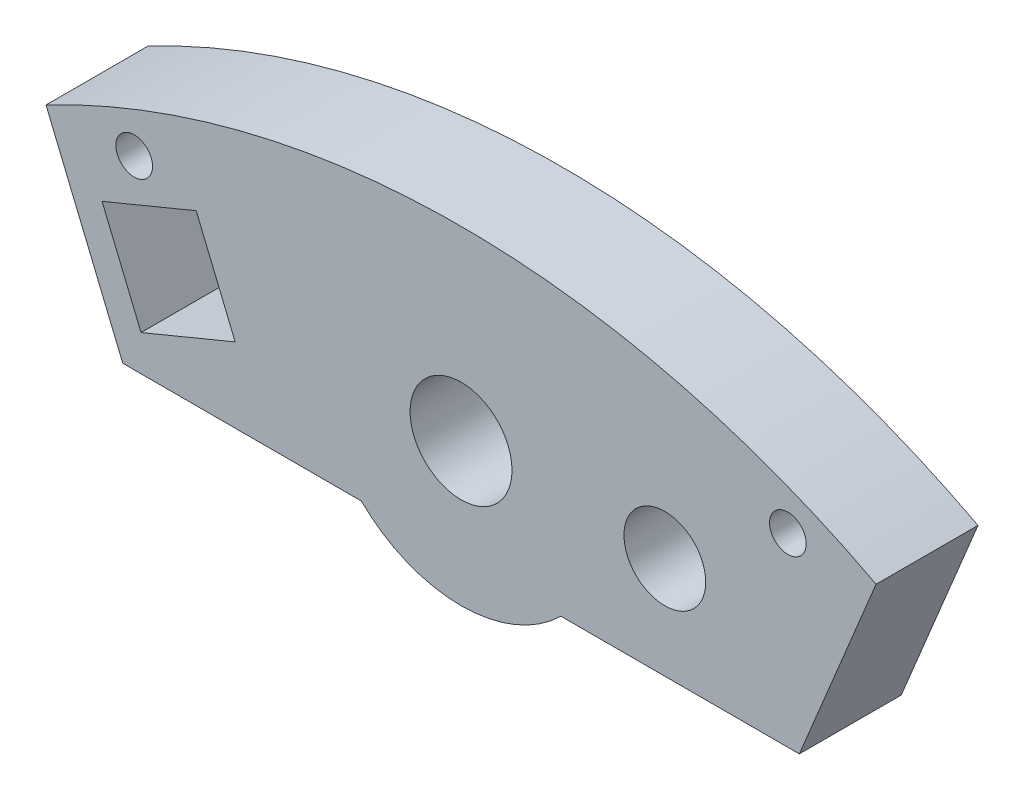
ISO-10303-21;
HEADER;
FILE_DESCRIPTION(('STEP AP214'),'2;1');
FILE_NAME('part.step','',(''),(''),'','','');
FILE_SCHEMA(('AUTOMOTIVE_DESIGN { 1 0 10303 214 1 1 1 1 }'));
ENDSEC;
DATA;
#1=APPLICATION_CONTEXT('core data for automotive mechanical design processes');
#2=APPLICATION_PROTOCOL_DEFINITION('international standard','automotive_design',2000,#1);
#3=PRODUCT_CONTEXT('',#1,'mechanical');
#4=PRODUCT('Part','Part','',(#3));
#5=PRODUCT_RELATED_PRODUCT_CATEGORY('part','',(#4));
#6=PRODUCT_DEFINITION_FORMATION('','',#4);
#7=PRODUCT_DEFINITION_CONTEXT('part definition',#1,'design');
#8=PRODUCT_DEFINITION('design','',#6,#7);
#9=PRODUCT_DEFINITION_SHAPE('','',#8);
#10=(LENGTH_UNIT() NAMED_UNIT(*) SI_UNIT(.MILLI.,.METRE.));
#11=(NAMED_UNIT(*) PLANE_ANGLE_UNIT() SI_UNIT($,.RADIAN.));
#12=(NAMED_UNIT(*) SI_UNIT($,.STERADIAN.) SOLID_ANGLE_UNIT());
#13=UNCERTAINTY_MEASURE_WITH_UNIT(LENGTH_MEASURE(1.E-05),#10,'distance_accuracy_value','');
#14=(GEOMETRIC_REPRESENTATION_CONTEXT(3) GLOBAL_UNCERTAINTY_ASSIGNED_CONTEXT((#13)) GLOBAL_UNIT_ASSIGNED_CONTEXT((#10,
#11,#12)) REPRESENTATION_CONTEXT('',''));
#15=CARTESIAN_POINT('',(0.,0.,0.));
#16=DIRECTION('',(0.,0.,1.));
#17=DIRECTION('',(1.,0.,0.));
#18=AXIS2_PLACEMENT_3D('',#15,#16,#17);
#19=CARTESIAN_POINT('',(0.,0.,10.));
#20=DIRECTION('',(0.,0.,1.));
#21=DIRECTION('',(1.,0.,0.));
#22=AXIS2_PLACEMENT_3D('',#19,#20,#21);
#23=PLANE('',#22);
#24=CARTESIAN_POINT('',(-32.0764524899467,8.18940663404685,10.));
#25=DIRECTION('',(0.,0.,1.));
#26=DIRECTION('',(1.,0.,0.));
#27=AXIS2_PLACEMENT_3D('',#24,#25,#26);
#28=CIRCLE('',#27,1.8);
#29=CARTESIAN_POINT('',(-30.2764524899467,8.18940663404685,10.));
#30=VERTEX_POINT('',#29);
#31=EDGE_CURVE('E152',#30,#30,#28,.T.);
#32=ORIENTED_EDGE('',*,*,#31,.F.);
#33=EDGE_LOOP('',(#32));
#34=FACE_BOUND('',#33,.T.);
#35=CARTESIAN_POINT('',(20.,0.,10.));
#36=DIRECTION('',(0.,0.,1.));
#37=DIRECTION('',(1.,0.,0.));
#38=AXIS2_PLACEMENT_3D('',#35,#36,#37);
#39=CIRCLE('',#38,4.0125);
#40=CARTESIAN_POINT('',(24.0125,0.,10.));
#41=VERTEX_POINT('',#40);
#42=EDGE_CURVE('E176',#41,#41,#39,.T.);
#43=ORIENTED_EDGE('',*,*,#42,.F.);
#44=EDGE_LOOP('',(#43));
#45=FACE_BOUND('',#44,.T.);
#46=DIRECTION('',(0.382683432365087,0.923879532511288,0.));
#47=VECTOR('',#46,1.);
#48=CARTESIAN_POINT('',(40.7355900922859,8.18940663404685,10.));
#49=LINE('',#48,#47);
#50=CARTESIAN_POINT('',(33.2012911729446,-10.,10.));
#51=VERTEX_POINT('',#50);
#52=CARTESIAN_POINT('',(40.7355900922859,8.18940663404685,10.));
#53=VERTEX_POINT('',#52);
#54=EDGE_CURVE('E184',#51,#53,#49,.T.);
#55=ORIENTED_EDGE('',*,*,#54,.T.);
#56=CARTESIAN_POINT('',(0.,-69.25,10.));
#57=DIRECTION('',(0.,0.,1.));
#58=DIRECTION('',(1.,0.,0.));
#59=AXIS2_PLACEMENT_3D('',#56,#57,#58);
#60=CIRCLE('',#59,87.5);
#61=CARTESIAN_POINT('',(-40.7355900922859,8.18940663404685,10.));
#62=VERTEX_POINT('',#61);
#63=EDGE_CURVE('E188',#53,#62,#60,.T.);
#64=ORIENTED_EDGE('',*,*,#63,.T.);
#65=DIRECTION('',(0.382683432365087,-0.923879532511288,0.));
#66=VECTOR('',#65,1.);
#67=CARTESIAN_POINT('',(-40.7355900922859,8.18940663404685,10.));
#68=LINE('',#67,#66);
#69=CARTESIAN_POINT('',(-33.2012911729446,-10.,10.));
#70=VERTEX_POINT('',#69);
#71=EDGE_CURVE('E192',#62,#70,#68,.T.);
#72=ORIENTED_EDGE('',*,*,#71,.T.);
#73=DIRECTION('',(1.,0.,0.));
#74=VECTOR('',#73,1.);
#75=CARTESIAN_POINT('',(-33.2012911729446,-10.,10.));
#76=LINE('',#75,#74);
#77=CARTESIAN_POINT('',(-9.79795897113272,-9.99999999999999,10.));
#78=VERTEX_POINT('',#77);
#79=EDGE_CURVE('E195',#70,#78,#76,.T.);
#80=ORIENTED_EDGE('',*,*,#79,.T.);
#81=CARTESIAN_POINT('',(0.,0.,10.));
#82=DIRECTION('',(0.,0.,1.));
#83=DIRECTION('',(1.,0.,0.));
#84=AXIS2_PLACEMENT_3D('',#81,#82,#83);
#85=CIRCLE('',#84,14.);
#86=CARTESIAN_POINT('',(9.79795897113271,-10.,10.));
#87=VERTEX_POINT('',#86);
#88=EDGE_CURVE('E198',#78,#87,#85,.T.);
#89=ORIENTED_EDGE('',*,*,#88,.T.);
#90=DIRECTION('',(1.,0.,0.));
#91=VECTOR('',#90,1.);
#92=CARTESIAN_POINT('',(33.2012911729446,-10.,10.));
#93=LINE('',#92,#91);
#94=EDGE_CURVE('E201',#87,#51,#93,.T.);
#95=ORIENTED_EDGE('',*,*,#94,.T.);
#96=EDGE_LOOP('',(#55,#64,#72,#80,#89,#95));
#97=FACE_BOUND('',#96,.T.);
#98=CARTESIAN_POINT('',(0.,0.,10.));
#99=DIRECTION('',(0.,0.,1.));
#100=DIRECTION('',(1.,0.,0.));
#101=AXIS2_PLACEMENT_3D('',#98,#99,#100);
#102=CIRCLE('',#101,5.);
#103=CARTESIAN_POINT('',(5.,0.,10.));
#104=VERTEX_POINT('',#103);
#105=EDGE_CURVE('E168',#104,#104,#102,.T.);
#106=ORIENTED_EDGE('',*,*,#105,.F.);
#107=EDGE_LOOP('',(#106));
#108=FACE_BOUND('',#107,.T.);
#109=DIRECTION('',(-0.923879532511288,-0.382683432365087,0.));
#110=VECTOR('',#109,1.);
#111=CARTESIAN_POINT('',(-25.9952769266503,6.57377976272854,10.));
#112=LINE('',#111,#110);
#113=CARTESIAN_POINT('',(-25.9952769266503,6.57377976272854,10.));
#114=VERTEX_POINT('',#113);
#115=CARTESIAN_POINT('',(-35.2340722517632,2.74694543907767,10.));
#116=VERTEX_POINT('',#115);
#117=EDGE_CURVE('E126',#114,#116,#112,.T.);
#118=ORIENTED_EDGE('',*,*,#117,.F.);
#119=DIRECTION('',(-0.382683432365087,0.923879532511288,0.));
#120=VECTOR('',#119,1.);
#121=CARTESIAN_POINT('',(-22.1684426029994,-2.66501556238433,10.));
#122=LINE('',#121,#120);
#123=CARTESIAN_POINT('',(-22.1684426029994,-2.66501556238433,10.));
#124=VERTEX_POINT('',#123);
#125=EDGE_CURVE('E117',#124,#114,#122,.T.);
#126=ORIENTED_EDGE('',*,*,#125,.F.);
#127=DIRECTION('',(0.923879532511288,0.382683432365087,0.));
#128=VECTOR('',#127,1.);
#129=CARTESIAN_POINT('',(-31.4072379281123,-6.4918498860352,10.));
#130=LINE('',#129,#128);
#131=CARTESIAN_POINT('',(-31.4072379281123,-6.4918498860352,10.));
#132=VERTEX_POINT('',#131);
#133=EDGE_CURVE('E144',#132,#124,#130,.T.);
#134=ORIENTED_EDGE('',*,*,#133,.F.);
#135=DIRECTION('',(0.382683432365087,-0.923879532511288,0.));
#136=VECTOR('',#135,1.);
#137=CARTESIAN_POINT('',(-35.2340722517632,2.74694543907767,10.));
#138=LINE('',#137,#136);
#139=EDGE_CURVE('E140',#116,#132,#138,.T.);
#140=ORIENTED_EDGE('',*,*,#139,.F.);
#141=EDGE_LOOP('',(#118,#126,#134,#140));
#142=FACE_BOUND('',#141,.T.);
#143=CARTESIAN_POINT('',(32.0764524899467,8.18940663404685,10.));
#144=DIRECTION('',(0.,0.,1.));
#145=DIRECTION('',(-1.,0.,0.));
#146=AXIS2_PLACEMENT_3D('',#143,#144,#145);
#147=CIRCLE('',#146,1.8);
#148=CARTESIAN_POINT('',(30.2764524899467,8.18940663404685,10.));
#149=VERTEX_POINT('',#148);
#150=EDGE_CURVE('E318',#149,#149,#147,.T.);
#151=ORIENTED_EDGE('',*,*,#150,.F.);
#152=EDGE_LOOP('',(#151));
#153=FACE_BOUND('',#152,.T.);
#154=ADVANCED_FACE('F39',(#34,#45,#97,#108,#142,#153),#23,.T.);
#155=CARTESIAN_POINT('',(0.,0.,0.));
#156=DIRECTION('',(0.,0.,1.));
#157=DIRECTION('',(1.,0.,0.));
#158=AXIS2_PLACEMENT_3D('',#155,#156,#157);
#159=PLANE('',#158);
#160=CARTESIAN_POINT('',(0.,0.,0.));
#161=DIRECTION('',(0.,0.,1.));
#162=DIRECTION('',(1.,0.,0.));
#163=AXIS2_PLACEMENT_3D('',#160,#161,#162);
#164=CIRCLE('',#163,5.);
#165=CARTESIAN_POINT('',(5.,0.,0.));
#166=VERTEX_POINT('',#165);
#167=EDGE_CURVE('E135',#166,#166,#164,.T.);
#168=ORIENTED_EDGE('',*,*,#167,.T.);
#169=EDGE_LOOP('',(#168));
#170=FACE_BOUND('',#169,.T.);
#171=CARTESIAN_POINT('',(20.,0.,0.));
#172=DIRECTION('',(0.,0.,1.));
#173=DIRECTION('',(1.,0.,0.));
#174=AXIS2_PLACEMENT_3D('',#171,#172,#173);
#175=CIRCLE('',#174,4.0125);
#176=CARTESIAN_POINT('',(24.0125,0.,0.));
#177=VERTEX_POINT('',#176);
#178=EDGE_CURVE('E172',#177,#177,#175,.T.);
#179=ORIENTED_EDGE('',*,*,#178,.T.);
#180=EDGE_LOOP('',(#179));
#181=FACE_BOUND('',#180,.T.);
#182=DIRECTION('',(0.382683432365087,0.923879532511288,0.));
#183=VECTOR('',#182,1.);
#184=CARTESIAN_POINT('',(40.7355900922859,8.18940663404685,0.));
#185=LINE('',#184,#183);
#186=CARTESIAN_POINT('',(33.2012911729446,-10.,0.));
#187=VERTEX_POINT('',#186);
#188=CARTESIAN_POINT('',(40.7355900922859,8.18940663404685,0.));
#189=VERTEX_POINT('',#188);
#190=EDGE_CURVE('E180',#187,#189,#185,.T.);
#191=ORIENTED_EDGE('',*,*,#190,.F.);
#192=DIRECTION('',(1.,0.,0.));
#193=VECTOR('',#192,1.);
#194=CARTESIAN_POINT('',(33.2012911729446,-10.,0.));
#195=LINE('',#194,#193);
#196=CARTESIAN_POINT('',(9.79795897113271,-10.,0.));
#197=VERTEX_POINT('',#196);
#198=EDGE_CURVE('E189',#197,#187,#195,.T.);
#199=ORIENTED_EDGE('',*,*,#198,.F.);
#200=CARTESIAN_POINT('',(0.,0.,0.));
#201=DIRECTION('',(0.,0.,1.));
#202=DIRECTION('',(1.,0.,0.));
#203=AXIS2_PLACEMENT_3D('',#200,#201,#202);
#204=CIRCLE('',#203,14.);
#205=CARTESIAN_POINT('',(-9.79795897113272,-9.99999999999999,0.));
#206=VERTEX_POINT('',#205);
#207=EDGE_CURVE('E217',#206,#197,#204,.T.);
#208=ORIENTED_EDGE('',*,*,#207,.F.);
#209=DIRECTION('',(1.,0.,0.));
#210=VECTOR('',#209,1.);
#211=CARTESIAN_POINT('',(-33.2012911729446,-10.,0.));
#212=LINE('',#211,#210);
#213=CARTESIAN_POINT('',(-33.2012911729446,-10.,0.));
#214=VERTEX_POINT('',#213);
#215=EDGE_CURVE('E214',#214,#206,#212,.T.);
#216=ORIENTED_EDGE('',*,*,#215,.F.);
#217=DIRECTION('',(0.382683432365087,-0.923879532511288,0.));
#218=VECTOR('',#217,1.);
#219=CARTESIAN_POINT('',(-40.7355900922859,8.18940663404685,0.));
#220=LINE('',#219,#218);
#221=CARTESIAN_POINT('',(-40.7355900922859,8.18940663404685,0.));
#222=VERTEX_POINT('',#221);
#223=EDGE_CURVE('E211',#222,#214,#220,.T.);
#224=ORIENTED_EDGE('',*,*,#223,.F.);
#225=CARTESIAN_POINT('',(0.,-69.25,0.));
#226=DIRECTION('',(0.,0.,1.));
#227=DIRECTION('',(1.,0.,0.));
#228=AXIS2_PLACEMENT_3D('',#225,#226,#227);
#229=CIRCLE('',#228,87.5);
#230=EDGE_CURVE('E208',#189,#222,#229,.T.);
#231=ORIENTED_EDGE('',*,*,#230,.F.);
#232=EDGE_LOOP('',(#191,#199,#208,#216,#224,#231));
#233=FACE_BOUND('',#232,.T.);
#234=DIRECTION('',(-0.382683432365087,0.923879532511288,0.));
#235=VECTOR('',#234,1.);
#236=CARTESIAN_POINT('',(-22.1684426029994,-2.66501556238433,0.));
#237=LINE('',#236,#235);
#238=CARTESIAN_POINT('',(-22.1684426029994,-2.66501556238433,0.));
#239=VERTEX_POINT('',#238);
#240=CARTESIAN_POINT('',(-25.9952769266503,6.57377976272854,0.));
#241=VERTEX_POINT('',#240);
#242=EDGE_CURVE('E63',#239,#241,#237,.T.);
#243=ORIENTED_EDGE('',*,*,#242,.T.);
#244=DIRECTION('',(-0.923879532511288,-0.382683432365087,0.));
#245=VECTOR('',#244,1.);
#246=CARTESIAN_POINT('',(-25.9952769266503,6.57377976272854,0.));
#247=LINE('',#246,#245);
#248=CARTESIAN_POINT('',(-35.2340722517632,2.74694543907767,0.));
#249=VERTEX_POINT('',#248);
#250=EDGE_CURVE('E133',#241,#249,#247,.T.);
#251=ORIENTED_EDGE('',*,*,#250,.T.);
#252=DIRECTION('',(0.382683432365087,-0.923879532511288,0.));
#253=VECTOR('',#252,1.);
#254=CARTESIAN_POINT('',(-35.2340722517632,2.74694543907767,0.));
#255=LINE('',#254,#253);
#256=CARTESIAN_POINT('',(-31.4072379281123,-6.4918498860352,0.));
#257=VERTEX_POINT('',#256);
#258=EDGE_CURVE('E155',#249,#257,#255,.T.);
#259=ORIENTED_EDGE('',*,*,#258,.T.);
#260=DIRECTION('',(0.923879532511288,0.382683432365087,0.));
#261=VECTOR('',#260,1.);
#262=CARTESIAN_POINT('',(-31.4072379281123,-6.4918498860352,0.));
#263=LINE('',#262,#261);
#264=EDGE_CURVE('E127',#257,#239,#263,.T.);
#265=ORIENTED_EDGE('',*,*,#264,.T.);
#266=EDGE_LOOP('',(#243,#251,#259,#265));
#267=FACE_BOUND('',#266,.T.);
#268=CARTESIAN_POINT('',(-32.0764524899467,8.18940663404685,0.));
#269=DIRECTION('',(0.,0.,1.));
#270=DIRECTION('',(1.,0.,0.));
#271=AXIS2_PLACEMENT_3D('',#268,#269,#270);
#272=CIRCLE('',#271,1.8);
#273=CARTESIAN_POINT('',(-30.2764524899467,8.18940663404685,0.));
#274=VERTEX_POINT('',#273);
#275=EDGE_CURVE('E326',#274,#274,#272,.T.);
#276=ORIENTED_EDGE('',*,*,#275,.T.);
#277=EDGE_LOOP('',(#276));
#278=FACE_BOUND('',#277,.T.);
#279=CARTESIAN_POINT('',(32.0764524899467,8.18940663404685,0.));
#280=DIRECTION('',(0.,0.,1.));
#281=DIRECTION('',(-1.,0.,0.));
#282=AXIS2_PLACEMENT_3D('',#279,#280,#281);
#283=CIRCLE('',#282,1.8);
#284=CARTESIAN_POINT('',(30.2764524899467,8.18940663404685,0.));
#285=VERTEX_POINT('',#284);
#286=EDGE_CURVE('E321',#285,#285,#283,.T.);
#287=ORIENTED_EDGE('',*,*,#286,.T.);
#288=EDGE_LOOP('',(#287));
#289=FACE_BOUND('',#288,.T.);
#290=ADVANCED_FACE('F248',(#170,#181,#233,#267,#278,#289),#159,.F.);
#291=CARTESIAN_POINT('',(40.7355900922859,8.18940663404685,10.));
#292=DIRECTION('',(-0.923879532511288,0.382683432365087,0.));
#293=DIRECTION('',(-0.382683432365087,-0.923879532511288,0.));
#294=AXIS2_PLACEMENT_3D('',#291,#292,#293);
#295=PLANE('',#294);
#296=ORIENTED_EDGE('',*,*,#190,.T.);
#297=DIRECTION('',(0.,0.,-1.));
#298=VECTOR('',#297,1.);
#299=CARTESIAN_POINT('',(40.7355900922859,8.18940663404685,10.));
#300=LINE('',#299,#298);
#301=EDGE_CURVE('E11',#53,#189,#300,.T.);
#302=ORIENTED_EDGE('',*,*,#301,.F.);
#303=ORIENTED_EDGE('',*,*,#54,.F.);
#304=DIRECTION('',(0.,0.,-1.));
#305=VECTOR('',#304,1.);
#306=CARTESIAN_POINT('',(33.2012911729446,-10.,10.));
#307=LINE('',#306,#305);
#308=EDGE_CURVE('E204',#51,#187,#307,.T.);
#309=ORIENTED_EDGE('',*,*,#308,.T.);
#310=EDGE_LOOP('',(#296,#302,#303,#309));
#311=FACE_BOUND('',#310,.T.);
#312=ADVANCED_FACE('F41',(#311),#295,.F.);
#313=CARTESIAN_POINT('',(0.,-69.25,10.));
#314=DIRECTION('',(0.,0.,-1.));
#315=DIRECTION('',(-1.,0.,0.));
#316=AXIS2_PLACEMENT_3D('',#313,#314,#315);
#317=CYLINDRICAL_SURFACE('',#316,87.5);
#318=ORIENTED_EDGE('',*,*,#230,.T.);
#319=DIRECTION('',(0.,0.,-1.));
#320=VECTOR('',#319,1.);
#321=CARTESIAN_POINT('',(-40.7355900922859,8.18940663404685,10.));
#322=LINE('',#321,#320);
#323=EDGE_CURVE('E48',#62,#222,#322,.T.);
#324=ORIENTED_EDGE('',*,*,#323,.F.);
#325=ORIENTED_EDGE('',*,*,#63,.F.);
#326=ORIENTED_EDGE('',*,*,#301,.T.);
#327=EDGE_LOOP('',(#318,#324,#325,#326));
#328=FACE_BOUND('',#327,.T.);
#329=ADVANCED_FACE('F266',(#328),#317,.T.);
#330=CARTESIAN_POINT('',(-40.7355900922859,8.18940663404685,10.));
#331=DIRECTION('',(0.923879532511288,0.382683432365087,0.));
#332=DIRECTION('',(-0.382683432365087,0.923879532511288,0.));
#333=AXIS2_PLACEMENT_3D('',#330,#331,#332);
#334=PLANE('',#333);
#335=ORIENTED_EDGE('',*,*,#223,.T.);
#336=DIRECTION('',(0.,0.,-1.));
#337=VECTOR('',#336,1.);
#338=CARTESIAN_POINT('',(-33.2012911729446,-10.,10.));
#339=LINE('',#338,#337);
#340=EDGE_CURVE('E233',#70,#214,#339,.T.);
#341=ORIENTED_EDGE('',*,*,#340,.F.);
#342=ORIENTED_EDGE('',*,*,#71,.F.);
#343=ORIENTED_EDGE('',*,*,#323,.T.);
#344=EDGE_LOOP('',(#335,#341,#342,#343));
#345=FACE_BOUND('',#344,.T.);
#346=ADVANCED_FACE('F242',(#345),#334,.F.);
#347=CARTESIAN_POINT('',(-33.2012911729446,-10.,10.));
#348=DIRECTION('',(0.,1.,0.));
#349=DIRECTION('',(0.,0.,1.));
#350=AXIS2_PLACEMENT_3D('',#347,#348,#349);
#351=PLANE('',#350);
#352=ORIENTED_EDGE('',*,*,#215,.T.);
#353=DIRECTION('',(0.,0.,-1.));
#354=VECTOR('',#353,1.);
#355=CARTESIAN_POINT('',(-9.79795897113272,-9.99999999999999,10.));
#356=LINE('',#355,#354);
#357=EDGE_CURVE('E229',#78,#206,#356,.T.);
#358=ORIENTED_EDGE('',*,*,#357,.F.);
#359=ORIENTED_EDGE('',*,*,#79,.F.);
#360=ORIENTED_EDGE('',*,*,#340,.T.);
#361=EDGE_LOOP('',(#352,#358,#359,#360));
#362=FACE_BOUND('',#361,.T.);
#363=ADVANCED_FACE('F254',(#362),#351,.F.);
#364=CARTESIAN_POINT('',(0.,0.,10.));
#365=DIRECTION('',(0.,0.,-1.));
#366=DIRECTION('',(-1.,0.,0.));
#367=AXIS2_PLACEMENT_3D('',#364,#365,#366);
#368=CYLINDRICAL_SURFACE('',#367,14.);
#369=ORIENTED_EDGE('',*,*,#207,.T.);
#370=DIRECTION('',(0.,0.,-1.));
#371=VECTOR('',#370,1.);
#372=CARTESIAN_POINT('',(9.79795897113271,-10.,10.));
#373=LINE('',#372,#371);
#374=EDGE_CURVE('E225',#87,#197,#373,.T.);
#375=ORIENTED_EDGE('',*,*,#374,.F.);
#376=ORIENTED_EDGE('',*,*,#88,.F.);
#377=ORIENTED_EDGE('',*,*,#357,.T.);
#378=EDGE_LOOP('',(#369,#375,#376,#377));
#379=FACE_BOUND('',#378,.T.);
#380=ADVANCED_FACE('F258',(#379),#368,.T.);
#381=CARTESIAN_POINT('',(33.2012911729446,-10.,10.));
#382=DIRECTION('',(0.,1.,0.));
#383=DIRECTION('',(0.,0.,1.));
#384=AXIS2_PLACEMENT_3D('',#381,#382,#383);
#385=PLANE('',#384);
#386=ORIENTED_EDGE('',*,*,#198,.T.);
#387=ORIENTED_EDGE('',*,*,#308,.F.);
#388=ORIENTED_EDGE('',*,*,#94,.F.);
#389=ORIENTED_EDGE('',*,*,#374,.T.);
#390=EDGE_LOOP('',(#386,#387,#388,#389));
#391=FACE_BOUND('',#390,.T.);
#392=ADVANCED_FACE('F269',(#391),#385,.F.);
#393=CARTESIAN_POINT('',(20.,0.,10.));
#394=DIRECTION('',(0.,0.,-1.));
#395=DIRECTION('',(-1.,0.,0.));
#396=AXIS2_PLACEMENT_3D('',#393,#394,#395);
#397=CYLINDRICAL_SURFACE('',#396,4.0125);
#398=ORIENTED_EDGE('',*,*,#42,.T.);
#399=EDGE_LOOP('',(#398));
#400=FACE_BOUND('',#399,.T.);
#401=ORIENTED_EDGE('',*,*,#178,.F.);
#402=EDGE_LOOP('',(#401));
#403=FACE_BOUND('',#402,.T.);
#404=ADVANCED_FACE('F271',(#400,#403),#397,.F.);
#405=CARTESIAN_POINT('',(0.,0.,10.));
#406=DIRECTION('',(0.,0.,-1.));
#407=DIRECTION('',(-1.,0.,0.));
#408=AXIS2_PLACEMENT_3D('',#405,#406,#407);
#409=CYLINDRICAL_SURFACE('',#408,5.);
#410=ORIENTED_EDGE('',*,*,#105,.T.);
#411=EDGE_LOOP('',(#410));
#412=FACE_BOUND('',#411,.T.);
#413=ORIENTED_EDGE('',*,*,#167,.F.);
#414=EDGE_LOOP('',(#413));
#415=FACE_BOUND('',#414,.T.);
#416=ADVANCED_FACE('F277',(#412,#415),#409,.F.);
#417=CARTESIAN_POINT('',(-22.1684426029994,-2.66501556238433,10.));
#418=DIRECTION('',(-0.923879532511288,-0.382683432365087,0.));
#419=DIRECTION('',(0.382683432365087,-0.923879532511288,0.));
#420=AXIS2_PLACEMENT_3D('',#417,#418,#419);
#421=PLANE('',#420);
#422=ORIENTED_EDGE('',*,*,#242,.F.);
#423=DIRECTION('',(0.,0.,-1.));
#424=VECTOR('',#423,1.);
#425=CARTESIAN_POINT('',(-22.1684426029994,-2.66501556238433,10.));
#426=LINE('',#425,#424);
#427=EDGE_CURVE('E121',#124,#239,#426,.T.);
#428=ORIENTED_EDGE('',*,*,#427,.F.);
#429=ORIENTED_EDGE('',*,*,#125,.T.);
#430=DIRECTION('',(0.,0.,-1.));
#431=VECTOR('',#430,1.);
#432=CARTESIAN_POINT('',(-25.9952769266503,6.57377976272854,10.));
#433=LINE('',#432,#431);
#434=EDGE_CURVE('E120',#114,#241,#433,.T.);
#435=ORIENTED_EDGE('',*,*,#434,.T.);
#436=EDGE_LOOP('',(#422,#428,#429,#435));
#437=FACE_BOUND('',#436,.T.);
#438=ADVANCED_FACE('F119',(#437),#421,.T.);
#439=CARTESIAN_POINT('',(-25.9952769266503,6.57377976272854,10.));
#440=DIRECTION('',(0.382683432365087,-0.923879532511288,0.));
#441=DIRECTION('',(0.923879532511288,0.382683432365087,0.));
#442=AXIS2_PLACEMENT_3D('',#439,#440,#441);
#443=PLANE('',#442);
#444=ORIENTED_EDGE('',*,*,#250,.F.);
#445=ORIENTED_EDGE('',*,*,#434,.F.);
#446=ORIENTED_EDGE('',*,*,#117,.T.);
#447=DIRECTION('',(0.,0.,-1.));
#448=VECTOR('',#447,1.);
#449=CARTESIAN_POINT('',(-35.2340722517632,2.74694543907767,10.));
#450=LINE('',#449,#448);
#451=EDGE_CURVE('E136',#116,#249,#450,.T.);
#452=ORIENTED_EDGE('',*,*,#451,.T.);
#453=EDGE_LOOP('',(#444,#445,#446,#452));
#454=FACE_BOUND('',#453,.T.);
#455=ADVANCED_FACE('F130',(#454),#443,.T.);
#456=CARTESIAN_POINT('',(-35.2340722517632,2.74694543907767,10.));
#457=DIRECTION('',(0.923879532511288,0.382683432365087,0.));
#458=DIRECTION('',(-0.382683432365087,0.923879532511288,0.));
#459=AXIS2_PLACEMENT_3D('',#456,#457,#458);
#460=PLANE('',#459);
#461=ORIENTED_EDGE('',*,*,#258,.F.);
#462=ORIENTED_EDGE('',*,*,#451,.F.);
#463=ORIENTED_EDGE('',*,*,#139,.T.);
#464=DIRECTION('',(0.,0.,-1.));
#465=VECTOR('',#464,1.);
#466=CARTESIAN_POINT('',(-31.4072379281123,-6.4918498860352,10.));
#467=LINE('',#466,#465);
#468=EDGE_CURVE('E55',#132,#257,#467,.T.);
#469=ORIENTED_EDGE('',*,*,#468,.T.);
#470=EDGE_LOOP('',(#461,#462,#463,#469));
#471=FACE_BOUND('',#470,.T.);
#472=ADVANCED_FACE('F299',(#471),#460,.T.);
#473=CARTESIAN_POINT('',(-31.4072379281123,-6.4918498860352,10.));
#474=DIRECTION('',(-0.382683432365087,0.923879532511288,0.));
#475=DIRECTION('',(-0.923879532511288,-0.382683432365087,0.));
#476=AXIS2_PLACEMENT_3D('',#473,#474,#475);
#477=PLANE('',#476);
#478=ORIENTED_EDGE('',*,*,#264,.F.);
#479=ORIENTED_EDGE('',*,*,#468,.F.);
#480=ORIENTED_EDGE('',*,*,#133,.T.);
#481=ORIENTED_EDGE('',*,*,#427,.T.);
#482=EDGE_LOOP('',(#478,#479,#480,#481));
#483=FACE_BOUND('',#482,.T.);
#484=ADVANCED_FACE('F302',(#483),#477,.T.);
#485=CARTESIAN_POINT('',(-32.0764524899467,8.18940663404685,10.));
#486=DIRECTION('',(0.,0.,-1.));
#487=DIRECTION('',(-1.,0.,0.));
#488=AXIS2_PLACEMENT_3D('',#485,#486,#487);
#489=CYLINDRICAL_SURFACE('',#488,1.8);
#490=ORIENTED_EDGE('',*,*,#31,.T.);
#491=EDGE_LOOP('',(#490));
#492=FACE_BOUND('',#491,.T.);
#493=ORIENTED_EDGE('',*,*,#275,.F.);
#494=EDGE_LOOP('',(#493));
#495=FACE_BOUND('',#494,.T.);
#496=ADVANCED_FACE('F306',(#492,#495),#489,.F.);
#497=CARTESIAN_POINT('',(32.0764524899467,8.18940663404685,10.));
#498=DIRECTION('',(0.,0.,-1.));
#499=DIRECTION('',(-1.,0.,0.));
#500=AXIS2_PLACEMENT_3D('',#497,#498,#499);
#501=CYLINDRICAL_SURFACE('',#500,1.8);
#502=ORIENTED_EDGE('',*,*,#150,.T.);
#503=EDGE_LOOP('',(#502));
#504=FACE_BOUND('',#503,.T.);
#505=ORIENTED_EDGE('',*,*,#286,.F.);
#506=EDGE_LOOP('',(#505));
#507=FACE_BOUND('',#506,.T.);
#508=ADVANCED_FACE('F309',(#504,#507),#501,.F.);
#509=CLOSED_SHELL('',(#154,#290,#312,#329,#346,#363,#380,#392,#404,#416,#438,#455,#472,#484,
#496,#508));
#510=MANIFOLD_SOLID_BREP('B2',#509);
#511=ADVANCED_BREP_SHAPE_REPRESENTATION('',(#18,#510),#14);
#512=SHAPE_DEFINITION_REPRESENTATION(#9,#511);
ENDSEC;
END-ISO-10303-21;
